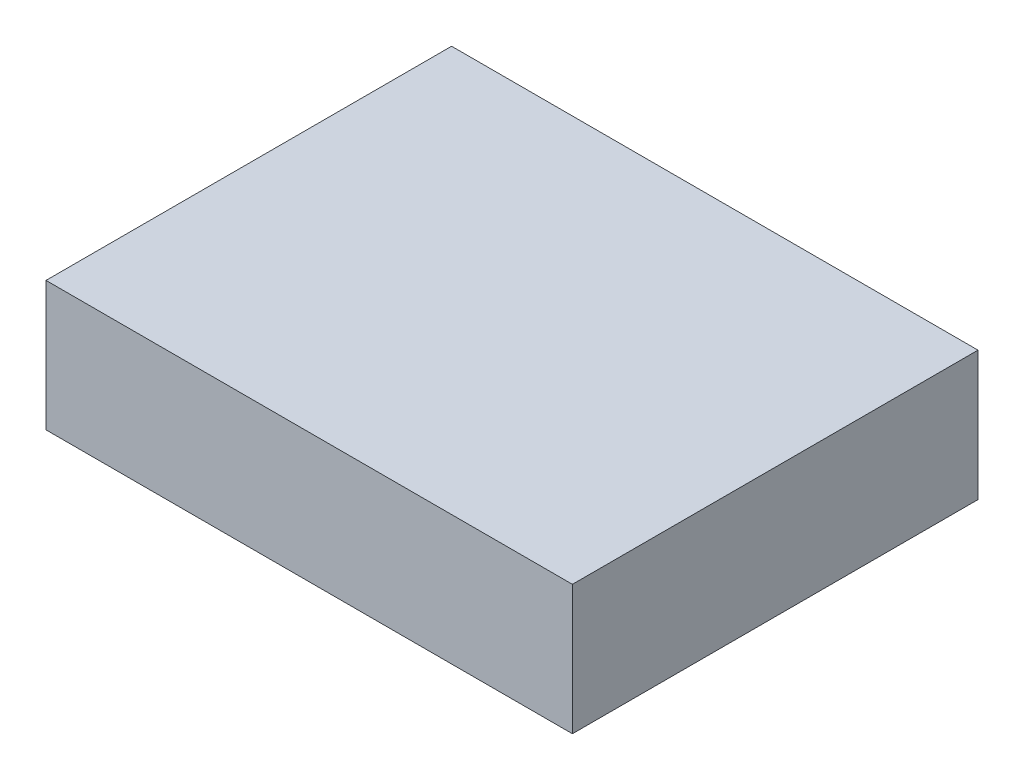
ISO-10303-21;
HEADER;
FILE_DESCRIPTION(('STEP AP214'),'2;1');
FILE_NAME('part.step','',(''),(''),'','','');
FILE_SCHEMA(('AUTOMOTIVE_DESIGN { 1 0 10303 214 1 1 1 1 }'));
ENDSEC;
DATA;
#1=APPLICATION_CONTEXT('core data for automotive mechanical design processes');
#2=APPLICATION_PROTOCOL_DEFINITION('international standard','automotive_design',2000,#1);
#3=PRODUCT_CONTEXT('',#1,'mechanical');
#4=PRODUCT('Part','Part','',(#3));
#5=PRODUCT_RELATED_PRODUCT_CATEGORY('part','',(#4));
#6=PRODUCT_DEFINITION_FORMATION('','',#4);
#7=PRODUCT_DEFINITION_CONTEXT('part definition',#1,'design');
#8=PRODUCT_DEFINITION('design','',#6,#7);
#9=PRODUCT_DEFINITION_SHAPE('','',#8);
#10=(LENGTH_UNIT() NAMED_UNIT(*) SI_UNIT(.MILLI.,.METRE.));
#11=(NAMED_UNIT(*) PLANE_ANGLE_UNIT() SI_UNIT($,.RADIAN.));
#12=(NAMED_UNIT(*) SI_UNIT($,.STERADIAN.) SOLID_ANGLE_UNIT());
#13=UNCERTAINTY_MEASURE_WITH_UNIT(LENGTH_MEASURE(1.E-05),#10,'distance_accuracy_value','');
#14=(GEOMETRIC_REPRESENTATION_CONTEXT(3) GLOBAL_UNCERTAINTY_ASSIGNED_CONTEXT((#13)) GLOBAL_UNIT_ASSIGNED_CONTEXT((#10,
#11,#12)) REPRESENTATION_CONTEXT('',''));
#15=CARTESIAN_POINT('',(0.,0.,0.));
#16=DIRECTION('',(0.,0.,1.));
#17=DIRECTION('',(1.,0.,0.));
#18=AXIS2_PLACEMENT_3D('',#15,#16,#17);
#19=CARTESIAN_POINT('',(0.,15.,0.));
#20=DIRECTION('',(1.,0.,0.));
#21=DIRECTION('',(0.,0.,-1.));
#22=AXIS2_PLACEMENT_3D('',#19,#20,#21);
#23=PLANE('',#22);
#24=DIRECTION('',(0.,0.,1.));
#25=VECTOR('',#24,1.);
#26=CARTESIAN_POINT('',(0.,0.,0.));
#27=LINE('',#26,#25);
#28=CARTESIAN_POINT('',(0.,0.,-47.));
#29=VERTEX_POINT('',#28);
#30=CARTESIAN_POINT('',(0.,0.,0.));
#31=VERTEX_POINT('',#30);
#32=EDGE_CURVE('E108',#29,#31,#27,.T.);
#33=ORIENTED_EDGE('',*,*,#32,.T.);
#34=DIRECTION('',(0.,-1.,0.));
#35=VECTOR('',#34,1.);
#36=CARTESIAN_POINT('',(0.,15.,0.));
#37=LINE('',#36,#35);
#38=CARTESIAN_POINT('',(0.,15.,0.));
#39=VERTEX_POINT('',#38);
#40=EDGE_CURVE('E11',#39,#31,#37,.T.);
#41=ORIENTED_EDGE('',*,*,#40,.F.);
#42=DIRECTION('',(0.,0.,1.));
#43=VECTOR('',#42,1.);
#44=CARTESIAN_POINT('',(0.,15.,0.));
#45=LINE('',#44,#43);
#46=CARTESIAN_POINT('',(0.,15.,-47.));
#47=VERTEX_POINT('',#46);
#48=EDGE_CURVE('E96',#47,#39,#45,.T.);
#49=ORIENTED_EDGE('',*,*,#48,.F.);
#50=DIRECTION('',(0.,-1.,0.));
#51=VECTOR('',#50,1.);
#52=CARTESIAN_POINT('',(0.,15.,-47.));
#53=LINE('',#52,#51);
#54=EDGE_CURVE('E104',#47,#29,#53,.T.);
#55=ORIENTED_EDGE('',*,*,#54,.T.);
#56=EDGE_LOOP('',(#33,#41,#49,#55));
#57=FACE_BOUND('',#56,.T.);
#58=ADVANCED_FACE('F45',(#57),#23,.F.);
#59=CARTESIAN_POINT('',(0.,15.,0.));
#60=DIRECTION('',(0.,0.,-1.));
#61=DIRECTION('',(-1.,0.,0.));
#62=AXIS2_PLACEMENT_3D('',#59,#60,#61);
#63=PLANE('',#62);
#64=DIRECTION('',(1.,0.,0.));
#65=VECTOR('',#64,1.);
#66=CARTESIAN_POINT('',(0.,0.,0.));
#67=LINE('',#66,#65);
#68=CARTESIAN_POINT('',(61.,0.,0.));
#69=VERTEX_POINT('',#68);
#70=EDGE_CURVE('E100',#31,#69,#67,.T.);
#71=ORIENTED_EDGE('',*,*,#70,.T.);
#72=DIRECTION('',(0.,-1.,0.));
#73=VECTOR('',#72,1.);
#74=CARTESIAN_POINT('',(61.,15.,0.));
#75=LINE('',#74,#73);
#76=CARTESIAN_POINT('',(61.,15.,0.));
#77=VERTEX_POINT('',#76);
#78=EDGE_CURVE('E53',#77,#69,#75,.T.);
#79=ORIENTED_EDGE('',*,*,#78,.F.);
#80=DIRECTION('',(1.,0.,0.));
#81=VECTOR('',#80,1.);
#82=CARTESIAN_POINT('',(0.,15.,0.));
#83=LINE('',#82,#81);
#84=EDGE_CURVE('E91',#39,#77,#83,.T.);
#85=ORIENTED_EDGE('',*,*,#84,.F.);
#86=ORIENTED_EDGE('',*,*,#40,.T.);
#87=EDGE_LOOP('',(#71,#79,#85,#86));
#88=FACE_BOUND('',#87,.T.);
#89=ADVANCED_FACE('F99',(#88),#63,.F.);
#90=CARTESIAN_POINT('',(61.,15.,0.));
#91=DIRECTION('',(-1.,0.,0.));
#92=DIRECTION('',(0.,0.,1.));
#93=AXIS2_PLACEMENT_3D('',#90,#91,#92);
#94=PLANE('',#93);
#95=DIRECTION('',(0.,0.,-1.));
#96=VECTOR('',#95,1.);
#97=CARTESIAN_POINT('',(61.,0.,0.));
#98=LINE('',#97,#96);
#99=CARTESIAN_POINT('',(61.,0.,-47.));
#100=VERTEX_POINT('',#99);
#101=EDGE_CURVE('E78',#69,#100,#98,.T.);
#102=ORIENTED_EDGE('',*,*,#101,.T.);
#103=DIRECTION('',(0.,-1.,0.));
#104=VECTOR('',#103,1.);
#105=CARTESIAN_POINT('',(61.,15.,-47.));
#106=LINE('',#105,#104);
#107=CARTESIAN_POINT('',(61.,15.,-47.));
#108=VERTEX_POINT('',#107);
#109=EDGE_CURVE('E101',#108,#100,#106,.T.);
#110=ORIENTED_EDGE('',*,*,#109,.F.);
#111=DIRECTION('',(0.,0.,-1.));
#112=VECTOR('',#111,1.);
#113=CARTESIAN_POINT('',(61.,15.,0.));
#114=LINE('',#113,#112);
#115=EDGE_CURVE('E94',#77,#108,#114,.T.);
#116=ORIENTED_EDGE('',*,*,#115,.F.);
#117=ORIENTED_EDGE('',*,*,#78,.T.);
#118=EDGE_LOOP('',(#102,#110,#116,#117));
#119=FACE_BOUND('',#118,.T.);
#120=ADVANCED_FACE('F102',(#119),#94,.F.);
#121=CARTESIAN_POINT('',(0.,15.,-47.));
#122=DIRECTION('',(0.,0.,1.));
#123=DIRECTION('',(1.,0.,0.));
#124=AXIS2_PLACEMENT_3D('',#121,#122,#123);
#125=PLANE('',#124);
#126=DIRECTION('',(-1.,0.,0.));
#127=VECTOR('',#126,1.);
#128=CARTESIAN_POINT('',(0.,0.,-47.));
#129=LINE('',#128,#127);
#130=EDGE_CURVE('E84',#100,#29,#129,.T.);
#131=ORIENTED_EDGE('',*,*,#130,.T.);
#132=ORIENTED_EDGE('',*,*,#54,.F.);
#133=DIRECTION('',(-1.,0.,0.));
#134=VECTOR('',#133,1.);
#135=CARTESIAN_POINT('',(0.,15.,-47.));
#136=LINE('',#135,#134);
#137=EDGE_CURVE('E61',#108,#47,#136,.T.);
#138=ORIENTED_EDGE('',*,*,#137,.F.);
#139=ORIENTED_EDGE('',*,*,#109,.T.);
#140=EDGE_LOOP('',(#131,#132,#138,#139));
#141=FACE_BOUND('',#140,.T.);
#142=ADVANCED_FACE('F115',(#141),#125,.F.);
#143=CARTESIAN_POINT('',(0.,15.,0.));
#144=DIRECTION('',(0.,-1.,0.));
#145=DIRECTION('',(0.,0.,-1.));
#146=AXIS2_PLACEMENT_3D('',#143,#144,#145);
#147=PLANE('',#146);
#148=ORIENTED_EDGE('',*,*,#48,.T.);
#149=ORIENTED_EDGE('',*,*,#84,.T.);
#150=ORIENTED_EDGE('',*,*,#115,.T.);
#151=ORIENTED_EDGE('',*,*,#137,.T.);
#152=EDGE_LOOP('',(#148,#149,#150,#151));
#153=FACE_BOUND('',#152,.T.);
#154=ADVANCED_FACE('F92',(#153),#147,.F.);
#155=CARTESIAN_POINT('',(0.,0.,0.));
#156=DIRECTION('',(0.,-1.,0.));
#157=DIRECTION('',(0.,0.,-1.));
#158=AXIS2_PLACEMENT_3D('',#155,#156,#157);
#159=PLANE('',#158);
#160=ORIENTED_EDGE('',*,*,#32,.F.);
#161=ORIENTED_EDGE('',*,*,#130,.F.);
#162=ORIENTED_EDGE('',*,*,#101,.F.);
#163=ORIENTED_EDGE('',*,*,#70,.F.);
#164=EDGE_LOOP('',(#160,#161,#162,#163));
#165=FACE_BOUND('',#164,.T.);
#166=ADVANCED_FACE('F118',(#165),#159,.T.);
#167=CLOSED_SHELL('',(#58,#89,#120,#142,#154,#166));
#168=MANIFOLD_SOLID_BREP('B2',#167);
#169=ADVANCED_BREP_SHAPE_REPRESENTATION('',(#18,#168),#14);
#170=SHAPE_DEFINITION_REPRESENTATION(#9,#169);
ENDSEC;
END-ISO-10303-21;
